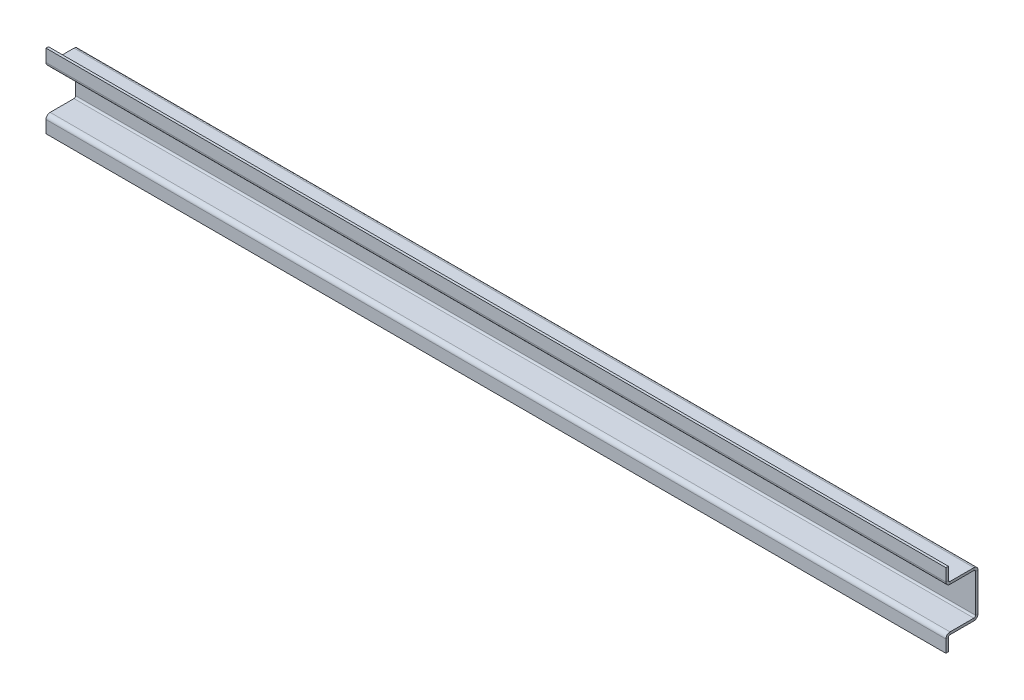
ISO-10303-21;
HEADER;
FILE_DESCRIPTION(('STEP AP214'),'2;1');
FILE_NAME('part.step','',(''),(''),'','','');
FILE_SCHEMA(('AUTOMOTIVE_DESIGN { 1 0 10303 214 1 1 1 1 }'));
ENDSEC;
DATA;
#1=APPLICATION_CONTEXT('core data for automotive mechanical design processes');
#2=APPLICATION_PROTOCOL_DEFINITION('international standard','automotive_design',2000,#1);
#3=PRODUCT_CONTEXT('',#1,'mechanical');
#4=PRODUCT('Part','Part','',(#3));
#5=PRODUCT_RELATED_PRODUCT_CATEGORY('part','',(#4));
#6=PRODUCT_DEFINITION_FORMATION('','',#4);
#7=PRODUCT_DEFINITION_CONTEXT('part definition',#1,'design');
#8=PRODUCT_DEFINITION('design','',#6,#7);
#9=PRODUCT_DEFINITION_SHAPE('','',#8);
#10=(LENGTH_UNIT() NAMED_UNIT(*) SI_UNIT(.MILLI.,.METRE.));
#11=(NAMED_UNIT(*) PLANE_ANGLE_UNIT() SI_UNIT($,.RADIAN.));
#12=(NAMED_UNIT(*) SI_UNIT($,.STERADIAN.) SOLID_ANGLE_UNIT());
#13=UNCERTAINTY_MEASURE_WITH_UNIT(LENGTH_MEASURE(1.E-05),#10,'distance_accuracy_value','');
#14=(GEOMETRIC_REPRESENTATION_CONTEXT(3) GLOBAL_UNCERTAINTY_ASSIGNED_CONTEXT((#13)) GLOBAL_UNIT_ASSIGNED_CONTEXT((#10,
#11,#12)) REPRESENTATION_CONTEXT('',''));
#15=CARTESIAN_POINT('',(0.,0.,0.));
#16=DIRECTION('',(0.,0.,1.));
#17=DIRECTION('',(1.,0.,0.));
#18=AXIS2_PLACEMENT_3D('',#15,#16,#17);
#19=CARTESIAN_POINT('',(273.,97.0000000000014,-1093.60301711881));
#20=DIRECTION('',(0.,-1.,0.));
#21=DIRECTION('',(0.,0.,-1.));
#22=AXIS2_PLACEMENT_3D('',#19,#20,#21);
#23=PLANE('',#22);
#24=DIRECTION('',(0.,0.,1.));
#25=VECTOR('',#24,1.);
#26=CARTESIAN_POINT('',(273.,97.0000000000014,-1093.60301711881));
#27=LINE('',#26,#25);
#28=CARTESIAN_POINT('',(273.,97.0000000000014,-3.0000000000001));
#29=VERTEX_POINT('',#28);
#30=CARTESIAN_POINT('',(273.,97.0000000000014,-1.5));
#31=VERTEX_POINT('',#30);
#32=EDGE_CURVE('E348',#29,#31,#27,.T.);
#33=ORIENTED_EDGE('',*,*,#32,.T.);
#34=DIRECTION('',(1.,0.,0.));
#35=VECTOR('',#34,1.);
#36=CARTESIAN_POINT('',(273.,97.0000000000014,-1.49999999999999));
#37=LINE('',#36,#35);
#38=CARTESIAN_POINT('',(-273.,97.0000000000014,-1.49999999999999));
#39=VERTEX_POINT('',#38);
#40=EDGE_CURVE('E339',#39,#31,#37,.T.);
#41=ORIENTED_EDGE('',*,*,#40,.F.);
#42=DIRECTION('',(0.,0.,1.));
#43=VECTOR('',#42,1.);
#44=CARTESIAN_POINT('',(-273.,97.0000000000014,-1093.60301711881));
#45=LINE('',#44,#43);
#46=CARTESIAN_POINT('',(-273.,97.0000000000014,-3.0000000000001));
#47=VERTEX_POINT('',#46);
#48=EDGE_CURVE('E336',#47,#39,#45,.T.);
#49=ORIENTED_EDGE('',*,*,#48,.F.);
#50=DIRECTION('',(1.,0.,0.));
#51=VECTOR('',#50,1.);
#52=CARTESIAN_POINT('',(273.,97.0000000000014,-2.99999999999999));
#53=LINE('',#52,#51);
#54=EDGE_CURVE('E86',#47,#29,#53,.T.);
#55=ORIENTED_EDGE('',*,*,#54,.T.);
#56=EDGE_LOOP('',(#33,#41,#49,#55));
#57=FACE_BOUND('',#56,.T.);
#58=ADVANCED_FACE('F42',(#57),#23,.T.);
#59=CARTESIAN_POINT('',(273.,133.500000000001,-1093.60301711881));
#60=DIRECTION('',(1.,0.,0.));
#61=DIRECTION('',(0.,0.,-1.));
#62=AXIS2_PLACEMENT_3D('',#59,#60,#61);
#63=PLANE('',#62);
#64=DIRECTION('',(0.,0.,1.));
#65=VECTOR('',#64,1.);
#66=CARTESIAN_POINT('',(273.,104.500000000001,-1093.60301711881));
#67=LINE('',#66,#65);
#68=CARTESIAN_POINT('',(273.,104.500000000001,-2.99999999999999));
#69=VERTEX_POINT('',#68);
#70=CARTESIAN_POINT('',(273.,104.500000000001,-1.49999999999999));
#71=VERTEX_POINT('',#70);
#72=EDGE_CURVE('E345',#69,#71,#67,.T.);
#73=ORIENTED_EDGE('',*,*,#72,.T.);
#74=DIRECTION('',(0.,1.,0.));
#75=VECTOR('',#74,1.);
#76=CARTESIAN_POINT('',(273.,133.500000000001,-1.49999999999999));
#77=LINE('',#76,#75);
#78=EDGE_CURVE('E342',#71,#31,#77,.F.);
#79=ORIENTED_EDGE('',*,*,#78,.T.);
#80=ORIENTED_EDGE('',*,*,#32,.F.);
#81=DIRECTION('',(0.,1.,0.));
#82=VECTOR('',#81,1.);
#83=CARTESIAN_POINT('',(273.,133.500000000001,-2.99999999999999));
#84=LINE('',#83,#82);
#85=EDGE_CURVE('E80',#29,#69,#84,.T.);
#86=ORIENTED_EDGE('',*,*,#85,.T.);
#87=EDGE_LOOP('',(#73,#79,#80,#86));
#88=FACE_BOUND('',#87,.T.);
#89=ADVANCED_FACE('F358',(#88),#63,.T.);
#90=CARTESIAN_POINT('',(273.,107.000000000001,-1.49999999999999));
#91=DIRECTION('',(0.,0.,1.));
#92=DIRECTION('',(0.,-1.,0.));
#93=AXIS2_PLACEMENT_3D('',#90,#91,#92);
#94=PLANE('',#93);
#95=DIRECTION('',(0.,1.,0.));
#96=VECTOR('',#95,1.);
#97=CARTESIAN_POINT('',(-273.,105.500000000001,-1.49999999999999));
#98=LINE('',#97,#96);
#99=CARTESIAN_POINT('',(-273.,104.500000000001,-1.49999999999999));
#100=VERTEX_POINT('',#99);
#101=EDGE_CURVE('E52',#39,#100,#98,.T.);
#102=ORIENTED_EDGE('',*,*,#101,.F.);
#103=ORIENTED_EDGE('',*,*,#40,.T.);
#104=ORIENTED_EDGE('',*,*,#78,.F.);
#105=DIRECTION('',(-1.,0.,0.));
#106=VECTOR('',#105,1.);
#107=CARTESIAN_POINT('',(273.,104.500000000001,-1.49999999999999));
#108=LINE('',#107,#106);
#109=EDGE_CURVE('E350',#100,#71,#108,.F.);
#110=ORIENTED_EDGE('',*,*,#109,.F.);
#111=EDGE_LOOP('',(#102,#103,#104,#110));
#112=FACE_BOUND('',#111,.T.);
#113=ADVANCED_FACE('F360',(#112),#94,.T.);
#114=CARTESIAN_POINT('',(-273.,105.500000000001,-1093.60301711881));
#115=DIRECTION('',(-1.,0.,0.));
#116=DIRECTION('',(0.,0.,1.));
#117=AXIS2_PLACEMENT_3D('',#114,#115,#116);
#118=PLANE('',#117);
#119=ORIENTED_EDGE('',*,*,#48,.T.);
#120=ORIENTED_EDGE('',*,*,#101,.T.);
#121=DIRECTION('',(0.,0.,1.));
#122=VECTOR('',#121,1.);
#123=CARTESIAN_POINT('',(-273.,104.500000000001,-1093.60301711881));
#124=LINE('',#123,#122);
#125=CARTESIAN_POINT('',(-273.,104.500000000001,-2.99999999999999));
#126=VERTEX_POINT('',#125);
#127=EDGE_CURVE('E256',#126,#100,#124,.T.);
#128=ORIENTED_EDGE('',*,*,#127,.F.);
#129=DIRECTION('',(0.,1.,0.));
#130=VECTOR('',#129,1.);
#131=CARTESIAN_POINT('',(-273.,105.500000000001,-2.99999999999999));
#132=LINE('',#131,#130);
#133=EDGE_CURVE('E11',#126,#47,#132,.F.);
#134=ORIENTED_EDGE('',*,*,#133,.T.);
#135=EDGE_LOOP('',(#119,#120,#128,#134));
#136=FACE_BOUND('',#135,.T.);
#137=ADVANCED_FACE('F363',(#136),#118,.T.);
#138=CARTESIAN_POINT('',(273.,107.000000000001,-2.99999999999999));
#139=DIRECTION('',(0.,0.,1.));
#140=DIRECTION('',(0.,-1.,0.));
#141=AXIS2_PLACEMENT_3D('',#138,#139,#140);
#142=PLANE('',#141);
#143=ORIENTED_EDGE('',*,*,#85,.F.);
#144=ORIENTED_EDGE('',*,*,#54,.F.);
#145=ORIENTED_EDGE('',*,*,#133,.F.);
#146=DIRECTION('',(1.,0.,0.));
#147=VECTOR('',#146,1.);
#148=CARTESIAN_POINT('',(273.,104.500000000001,-2.99999999999999));
#149=LINE('',#148,#147);
#150=EDGE_CURVE('E46',#69,#126,#149,.F.);
#151=ORIENTED_EDGE('',*,*,#150,.F.);
#152=EDGE_LOOP('',(#143,#144,#145,#151));
#153=FACE_BOUND('',#152,.T.);
#154=ADVANCED_FACE('F44',(#153),#142,.F.);
#155=CARTESIAN_POINT('',(273.,142.000000000001,-1093.60301711881));
#156=DIRECTION('',(0.,1.,0.));
#157=DIRECTION('',(0.,0.,1.));
#158=AXIS2_PLACEMENT_3D('',#155,#156,#157);
#159=PLANE('',#158);
#160=DIRECTION('',(0.,0.,1.));
#161=VECTOR('',#160,1.);
#162=CARTESIAN_POINT('',(-273.,142.000000000001,-1093.60301711881));
#163=LINE('',#162,#161);
#164=CARTESIAN_POINT('',(-273.,142.000000000001,-2.99999999999989));
#165=VERTEX_POINT('',#164);
#166=CARTESIAN_POINT('',(-273.,142.000000000001,-1.5));
#167=VERTEX_POINT('',#166);
#168=EDGE_CURVE('E327',#165,#167,#163,.T.);
#169=ORIENTED_EDGE('',*,*,#168,.T.);
#170=DIRECTION('',(1.,0.,0.));
#171=VECTOR('',#170,1.);
#172=CARTESIAN_POINT('',(273.,142.000000000001,-1.5));
#173=LINE('',#172,#171);
#174=CARTESIAN_POINT('',(273.,142.000000000001,-1.50000000000006));
#175=VERTEX_POINT('',#174);
#176=EDGE_CURVE('E94',#175,#167,#173,.F.);
#177=ORIENTED_EDGE('',*,*,#176,.F.);
#178=DIRECTION('',(0.,0.,1.));
#179=VECTOR('',#178,1.);
#180=CARTESIAN_POINT('',(273.,142.000000000001,-1093.60301711881));
#181=LINE('',#180,#179);
#182=CARTESIAN_POINT('',(273.,142.000000000001,-3.));
#183=VERTEX_POINT('',#182);
#184=EDGE_CURVE('E113',#183,#175,#181,.T.);
#185=ORIENTED_EDGE('',*,*,#184,.F.);
#186=DIRECTION('',(1.,0.,0.));
#187=VECTOR('',#186,1.);
#188=CARTESIAN_POINT('',(273.,142.000000000001,-3.));
#189=LINE('',#188,#187);
#190=EDGE_CURVE('E109',#183,#165,#189,.F.);
#191=ORIENTED_EDGE('',*,*,#190,.T.);
#192=EDGE_LOOP('',(#169,#177,#185,#191));
#193=FACE_BOUND('',#192,.T.);
#194=ADVANCED_FACE('F494',(#193),#159,.T.);
#195=CARTESIAN_POINT('',(-273.,105.500000000001,-1093.60301711881));
#196=DIRECTION('',(-1.,0.,0.));
#197=DIRECTION('',(0.,0.,1.));
#198=AXIS2_PLACEMENT_3D('',#195,#196,#197);
#199=PLANE('',#198);
#200=DIRECTION('',(0.,0.,1.));
#201=VECTOR('',#200,1.);
#202=CARTESIAN_POINT('',(-273.,134.500000000001,-1093.60301711881));
#203=LINE('',#202,#201);
#204=CARTESIAN_POINT('',(-273.,134.500000000001,-3.00000000000001));
#205=VERTEX_POINT('',#204);
#206=CARTESIAN_POINT('',(-273.,134.500000000001,-1.50000000000001));
#207=VERTEX_POINT('',#206);
#208=EDGE_CURVE('E323',#205,#207,#203,.T.);
#209=ORIENTED_EDGE('',*,*,#208,.T.);
#210=DIRECTION('',(0.,1.,0.));
#211=VECTOR('',#210,1.);
#212=CARTESIAN_POINT('',(-273.,105.500000000001,-1.5));
#213=LINE('',#212,#211);
#214=EDGE_CURVE('E321',#207,#167,#213,.T.);
#215=ORIENTED_EDGE('',*,*,#214,.T.);
#216=ORIENTED_EDGE('',*,*,#168,.F.);
#217=DIRECTION('',(0.,1.,0.));
#218=VECTOR('',#217,1.);
#219=CARTESIAN_POINT('',(-273.,105.500000000001,-3.));
#220=LINE('',#219,#218);
#221=EDGE_CURVE('E318',#165,#205,#220,.F.);
#222=ORIENTED_EDGE('',*,*,#221,.T.);
#223=EDGE_LOOP('',(#209,#215,#216,#222));
#224=FACE_BOUND('',#223,.T.);
#225=ADVANCED_FACE('F493',(#224),#199,.T.);
#226=CARTESIAN_POINT('',(273.,142.000000000001,-1.5));
#227=DIRECTION('',(0.,0.,1.));
#228=DIRECTION('',(1.,0.,0.));
#229=AXIS2_PLACEMENT_3D('',#226,#227,#228);
#230=PLANE('',#229);
#231=ORIENTED_EDGE('',*,*,#214,.F.);
#232=DIRECTION('',(1.,0.,0.));
#233=VECTOR('',#232,1.);
#234=CARTESIAN_POINT('',(273.,134.500000000001,-1.5));
#235=LINE('',#234,#233);
#236=CARTESIAN_POINT('',(273.,134.500000000001,-1.5));
#237=VERTEX_POINT('',#236);
#238=EDGE_CURVE('E315',#207,#237,#235,.T.);
#239=ORIENTED_EDGE('',*,*,#238,.T.);
#240=DIRECTION('',(0.,1.,0.));
#241=VECTOR('',#240,1.);
#242=CARTESIAN_POINT('',(273.,133.500000000001,-1.5));
#243=LINE('',#242,#241);
#244=EDGE_CURVE('E310',#175,#237,#243,.F.);
#245=ORIENTED_EDGE('',*,*,#244,.F.);
#246=ORIENTED_EDGE('',*,*,#176,.T.);
#247=EDGE_LOOP('',(#231,#239,#245,#246));
#248=FACE_BOUND('',#247,.T.);
#249=ADVANCED_FACE('F485',(#248),#230,.T.);
#250=CARTESIAN_POINT('',(273.,133.500000000001,-1093.60301711881));
#251=DIRECTION('',(1.,0.,0.));
#252=DIRECTION('',(0.,0.,-1.));
#253=AXIS2_PLACEMENT_3D('',#250,#251,#252);
#254=PLANE('',#253);
#255=ORIENTED_EDGE('',*,*,#184,.T.);
#256=ORIENTED_EDGE('',*,*,#244,.T.);
#257=DIRECTION('',(0.,0.,1.));
#258=VECTOR('',#257,1.);
#259=CARTESIAN_POINT('',(273.,134.500000000001,-1093.60301711881));
#260=LINE('',#259,#258);
#261=CARTESIAN_POINT('',(273.,134.500000000001,-3.00000000000001));
#262=VERTEX_POINT('',#261);
#263=EDGE_CURVE('E329',#262,#237,#260,.T.);
#264=ORIENTED_EDGE('',*,*,#263,.F.);
#265=DIRECTION('',(0.,1.,0.));
#266=VECTOR('',#265,1.);
#267=CARTESIAN_POINT('',(273.,133.500000000001,-3.));
#268=LINE('',#267,#266);
#269=EDGE_CURVE('E308',#262,#183,#268,.T.);
#270=ORIENTED_EDGE('',*,*,#269,.T.);
#271=EDGE_LOOP('',(#255,#256,#264,#270));
#272=FACE_BOUND('',#271,.T.);
#273=ADVANCED_FACE('F486',(#272),#254,.T.);
#274=CARTESIAN_POINT('',(273.,142.000000000001,-3.));
#275=DIRECTION('',(0.,0.,1.));
#276=DIRECTION('',(1.,0.,0.));
#277=AXIS2_PLACEMENT_3D('',#274,#275,#276);
#278=PLANE('',#277);
#279=ORIENTED_EDGE('',*,*,#269,.F.);
#280=DIRECTION('',(1.,0.,0.));
#281=VECTOR('',#280,1.);
#282=CARTESIAN_POINT('',(273.,134.500000000001,-3.));
#283=LINE('',#282,#281);
#284=EDGE_CURVE('E281',#205,#262,#283,.T.);
#285=ORIENTED_EDGE('',*,*,#284,.F.);
#286=ORIENTED_EDGE('',*,*,#221,.F.);
#287=ORIENTED_EDGE('',*,*,#190,.F.);
#288=EDGE_LOOP('',(#279,#285,#286,#287));
#289=FACE_BOUND('',#288,.T.);
#290=ADVANCED_FACE('F491',(#289),#278,.F.);
#291=CARTESIAN_POINT('',(273.,-960.385005389582,-18.5));
#292=DIRECTION('',(1.,0.,0.));
#293=DIRECTION('',(0.,1.,0.));
#294=AXIS2_PLACEMENT_3D('',#291,#292,#293);
#295=PLANE('',#294);
#296=DIRECTION('',(0.,0.,-1.));
#297=VECTOR('',#296,1.);
#298=CARTESIAN_POINT('',(273.,133.500000000001,-18.5));
#299=LINE('',#298,#297);
#300=CARTESIAN_POINT('',(273.,133.500000000001,-18.5));
#301=VERTEX_POINT('',#300);
#302=CARTESIAN_POINT('',(273.,133.500000000001,-4.));
#303=VERTEX_POINT('',#302);
#304=EDGE_CURVE('E293',#301,#303,#299,.F.);
#305=ORIENTED_EDGE('',*,*,#304,.T.);
#306=DIRECTION('',(0.,1.,0.));
#307=VECTOR('',#306,1.);
#308=CARTESIAN_POINT('',(273.,-960.385005389582,-4.00000000000003));
#309=LINE('',#308,#307);
#310=CARTESIAN_POINT('',(273.,132.000000000001,-4.));
#311=VERTEX_POINT('',#310);
#312=EDGE_CURVE('E296',#311,#303,#309,.T.);
#313=ORIENTED_EDGE('',*,*,#312,.F.);
#314=DIRECTION('',(0.,0.,-1.));
#315=VECTOR('',#314,1.);
#316=CARTESIAN_POINT('',(273.,132.000000000001,-18.5));
#317=LINE('',#316,#315);
#318=CARTESIAN_POINT('',(273.,132.000000000001,-18.5));
#319=VERTEX_POINT('',#318);
#320=EDGE_CURVE('E291',#311,#319,#317,.T.);
#321=ORIENTED_EDGE('',*,*,#320,.T.);
#322=DIRECTION('',(0.,1.,0.));
#323=VECTOR('',#322,1.);
#324=CARTESIAN_POINT('',(273.,-960.385005389582,-18.5));
#325=LINE('',#324,#323);
#326=EDGE_CURVE('E288',#319,#301,#325,.T.);
#327=ORIENTED_EDGE('',*,*,#326,.T.);
#328=EDGE_LOOP('',(#305,#313,#321,#327));
#329=FACE_BOUND('',#328,.T.);
#330=ADVANCED_FACE('F475',(#329),#295,.T.);
#331=CARTESIAN_POINT('',(273.,133.500000000001,-1.5));
#332=DIRECTION('',(0.,-1.,0.));
#333=DIRECTION('',(0.,0.,-1.));
#334=AXIS2_PLACEMENT_3D('',#331,#332,#333);
#335=PLANE('',#334);
#336=ORIENTED_EDGE('',*,*,#304,.F.);
#337=DIRECTION('',(-1.,0.,0.));
#338=VECTOR('',#337,1.);
#339=CARTESIAN_POINT('',(273.,133.500000000001,-18.5));
#340=LINE('',#339,#338);
#341=CARTESIAN_POINT('',(-273.,133.500000000001,-18.5));
#342=VERTEX_POINT('',#341);
#343=EDGE_CURVE('E302',#342,#301,#340,.F.);
#344=ORIENTED_EDGE('',*,*,#343,.F.);
#345=DIRECTION('',(0.,0.,1.));
#346=VECTOR('',#345,1.);
#347=CARTESIAN_POINT('',(-273.,133.500000000001,-18.5));
#348=LINE('',#347,#346);
#349=CARTESIAN_POINT('',(-273.,133.500000000001,-4.00000000000003));
#350=VERTEX_POINT('',#349);
#351=EDGE_CURVE('E286',#350,#342,#348,.F.);
#352=ORIENTED_EDGE('',*,*,#351,.F.);
#353=DIRECTION('',(1.,0.,0.));
#354=VECTOR('',#353,1.);
#355=CARTESIAN_POINT('',(273.,133.500000000001,-4.));
#356=LINE('',#355,#354);
#357=EDGE_CURVE('E298',#303,#350,#356,.F.);
#358=ORIENTED_EDGE('',*,*,#357,.F.);
#359=EDGE_LOOP('',(#336,#344,#352,#358));
#360=FACE_BOUND('',#359,.T.);
#361=ADVANCED_FACE('F472',(#360),#335,.F.);
#362=CARTESIAN_POINT('',(-273.,-960.385005389582,-18.5));
#363=DIRECTION('',(-1.,0.,0.));
#364=DIRECTION('',(0.,-1.,0.));
#365=AXIS2_PLACEMENT_3D('',#362,#363,#364);
#366=PLANE('',#365);
#367=ORIENTED_EDGE('',*,*,#351,.T.);
#368=DIRECTION('',(0.,1.,0.));
#369=VECTOR('',#368,1.);
#370=CARTESIAN_POINT('',(-273.,-960.385005389582,-18.5));
#371=LINE('',#370,#369);
#372=CARTESIAN_POINT('',(-273.,132.000000000001,-18.5));
#373=VERTEX_POINT('',#372);
#374=EDGE_CURVE('E305',#373,#342,#371,.T.);
#375=ORIENTED_EDGE('',*,*,#374,.F.);
#376=DIRECTION('',(0.,0.,1.));
#377=VECTOR('',#376,1.);
#378=CARTESIAN_POINT('',(-273.,132.000000000001,-18.5));
#379=LINE('',#378,#377);
#380=CARTESIAN_POINT('',(-273.,132.000000000001,-4.00000000000005));
#381=VERTEX_POINT('',#380);
#382=EDGE_CURVE('E135',#373,#381,#379,.T.);
#383=ORIENTED_EDGE('',*,*,#382,.T.);
#384=DIRECTION('',(0.,1.,0.));
#385=VECTOR('',#384,1.);
#386=CARTESIAN_POINT('',(-273.,-960.385005389582,-4.00000000000003));
#387=LINE('',#386,#385);
#388=EDGE_CURVE('E282',#381,#350,#387,.T.);
#389=ORIENTED_EDGE('',*,*,#388,.T.);
#390=EDGE_LOOP('',(#367,#375,#383,#389));
#391=FACE_BOUND('',#390,.T.);
#392=ADVANCED_FACE('F468',(#391),#366,.T.);
#393=CARTESIAN_POINT('',(273.,132.000000000001,-1.5));
#394=DIRECTION('',(0.,-1.,0.));
#395=DIRECTION('',(0.,0.,-1.));
#396=AXIS2_PLACEMENT_3D('',#393,#394,#395);
#397=PLANE('',#396);
#398=ORIENTED_EDGE('',*,*,#382,.F.);
#399=DIRECTION('',(-1.,0.,0.));
#400=VECTOR('',#399,1.);
#401=CARTESIAN_POINT('',(273.,132.000000000001,-18.5));
#402=LINE('',#401,#400);
#403=EDGE_CURVE('E140',#373,#319,#402,.F.);
#404=ORIENTED_EDGE('',*,*,#403,.T.);
#405=ORIENTED_EDGE('',*,*,#320,.F.);
#406=DIRECTION('',(-1.,0.,0.));
#407=VECTOR('',#406,1.);
#408=CARTESIAN_POINT('',(273.,132.000000000001,-4.));
#409=LINE('',#408,#407);
#410=EDGE_CURVE('E300',#381,#311,#409,.F.);
#411=ORIENTED_EDGE('',*,*,#410,.F.);
#412=EDGE_LOOP('',(#398,#404,#405,#411));
#413=FACE_BOUND('',#412,.T.);
#414=ADVANCED_FACE('F476',(#413),#397,.T.);
#415=CARTESIAN_POINT('',(-273.,1199.38500538958,-18.5));
#416=DIRECTION('',(-1.,0.,0.));
#417=DIRECTION('',(0.,1.,0.));
#418=AXIS2_PLACEMENT_3D('',#415,#416,#417);
#419=PLANE('',#418);
#420=DIRECTION('',(0.,0.,1.));
#421=VECTOR('',#420,1.);
#422=CARTESIAN_POINT('',(-273.,105.500000000001,-18.5));
#423=LINE('',#422,#421);
#424=CARTESIAN_POINT('',(-273.,105.500000000001,-18.5));
#425=VERTEX_POINT('',#424);
#426=CARTESIAN_POINT('',(-273.,105.500000000001,-3.99999999999999));
#427=VERTEX_POINT('',#426);
#428=EDGE_CURVE('E261',#425,#427,#423,.T.);
#429=ORIENTED_EDGE('',*,*,#428,.T.);
#430=DIRECTION('',(0.,-1.,0.));
#431=VECTOR('',#430,1.);
#432=CARTESIAN_POINT('',(-273.,1199.38500538958,-3.99999999999999));
#433=LINE('',#432,#431);
#434=CARTESIAN_POINT('',(-273.,107.000000000001,-3.99999999999999));
#435=VERTEX_POINT('',#434);
#436=EDGE_CURVE('E254',#435,#427,#433,.T.);
#437=ORIENTED_EDGE('',*,*,#436,.F.);
#438=DIRECTION('',(0.,0.,1.));
#439=VECTOR('',#438,1.);
#440=CARTESIAN_POINT('',(-273.,107.000000000001,-18.5));
#441=LINE('',#440,#439);
#442=CARTESIAN_POINT('',(-273.,107.000000000001,-18.5));
#443=VERTEX_POINT('',#442);
#444=EDGE_CURVE('E169',#435,#443,#441,.F.);
#445=ORIENTED_EDGE('',*,*,#444,.T.);
#446=DIRECTION('',(0.,-1.,0.));
#447=VECTOR('',#446,1.);
#448=CARTESIAN_POINT('',(-273.,1199.38500538958,-18.5));
#449=LINE('',#448,#447);
#450=EDGE_CURVE('E267',#443,#425,#449,.T.);
#451=ORIENTED_EDGE('',*,*,#450,.T.);
#452=EDGE_LOOP('',(#429,#437,#445,#451));
#453=FACE_BOUND('',#452,.T.);
#454=ADVANCED_FACE('F259',(#453),#419,.T.);
#455=CARTESIAN_POINT('',(273.,105.500000000001,-19.5));
#456=DIRECTION('',(0.,1.,0.));
#457=DIRECTION('',(0.,0.,1.));
#458=AXIS2_PLACEMENT_3D('',#455,#456,#457);
#459=PLANE('',#458);
#460=DIRECTION('',(0.,0.,-1.));
#461=VECTOR('',#460,1.);
#462=CARTESIAN_POINT('',(273.,105.500000000001,-18.5));
#463=LINE('',#462,#461);
#464=CARTESIAN_POINT('',(273.,105.500000000001,-3.99999999999999));
#465=VERTEX_POINT('',#464);
#466=CARTESIAN_POINT('',(273.,105.500000000001,-18.5));
#467=VERTEX_POINT('',#466);
#468=EDGE_CURVE('E269',#465,#467,#463,.T.);
#469=ORIENTED_EDGE('',*,*,#468,.F.);
#470=DIRECTION('',(1.,0.,0.));
#471=VECTOR('',#470,1.);
#472=CARTESIAN_POINT('',(273.,105.500000000001,-3.99999999999999));
#473=LINE('',#472,#471);
#474=EDGE_CURVE('E262',#427,#465,#473,.T.);
#475=ORIENTED_EDGE('',*,*,#474,.F.);
#476=ORIENTED_EDGE('',*,*,#428,.F.);
#477=DIRECTION('',(1.,0.,0.));
#478=VECTOR('',#477,1.);
#479=CARTESIAN_POINT('',(273.,105.500000000001,-18.5));
#480=LINE('',#479,#478);
#481=EDGE_CURVE('E275',#467,#425,#480,.F.);
#482=ORIENTED_EDGE('',*,*,#481,.F.);
#483=EDGE_LOOP('',(#469,#475,#476,#482));
#484=FACE_BOUND('',#483,.T.);
#485=ADVANCED_FACE('F533',(#484),#459,.F.);
#486=CARTESIAN_POINT('',(273.,1199.38500538958,-18.5));
#487=DIRECTION('',(1.,0.,0.));
#488=DIRECTION('',(0.,-1.,0.));
#489=AXIS2_PLACEMENT_3D('',#486,#487,#488);
#490=PLANE('',#489);
#491=ORIENTED_EDGE('',*,*,#468,.T.);
#492=DIRECTION('',(0.,-1.,0.));
#493=VECTOR('',#492,1.);
#494=CARTESIAN_POINT('',(273.,1199.38500538958,-18.5));
#495=LINE('',#494,#493);
#496=CARTESIAN_POINT('',(273.,107.000000000001,-18.5));
#497=VERTEX_POINT('',#496);
#498=EDGE_CURVE('E162',#497,#467,#495,.T.);
#499=ORIENTED_EDGE('',*,*,#498,.F.);
#500=DIRECTION('',(0.,0.,-1.));
#501=VECTOR('',#500,1.);
#502=CARTESIAN_POINT('',(273.,107.000000000001,-18.5));
#503=LINE('',#502,#501);
#504=CARTESIAN_POINT('',(273.,107.000000000001,-3.99999999999999));
#505=VERTEX_POINT('',#504);
#506=EDGE_CURVE('E427',#497,#505,#503,.F.);
#507=ORIENTED_EDGE('',*,*,#506,.T.);
#508=DIRECTION('',(0.,-1.,0.));
#509=VECTOR('',#508,1.);
#510=CARTESIAN_POINT('',(273.,1199.38500538958,-3.99999999999999));
#511=LINE('',#510,#509);
#512=EDGE_CURVE('E248',#505,#465,#511,.T.);
#513=ORIENTED_EDGE('',*,*,#512,.T.);
#514=EDGE_LOOP('',(#491,#499,#507,#513));
#515=FACE_BOUND('',#514,.T.);
#516=ADVANCED_FACE('F429',(#515),#490,.T.);
#517=CARTESIAN_POINT('',(273.,107.000000000001,-19.5));
#518=DIRECTION('',(0.,1.,0.));
#519=DIRECTION('',(0.,0.,1.));
#520=AXIS2_PLACEMENT_3D('',#517,#518,#519);
#521=PLANE('',#520);
#522=ORIENTED_EDGE('',*,*,#444,.F.);
#523=DIRECTION('',(1.,0.,0.));
#524=VECTOR('',#523,1.);
#525=CARTESIAN_POINT('',(273.,107.000000000001,-3.99999999999999));
#526=LINE('',#525,#524);
#527=EDGE_CURVE('E239',#435,#505,#526,.T.);
#528=ORIENTED_EDGE('',*,*,#527,.T.);
#529=ORIENTED_EDGE('',*,*,#506,.F.);
#530=DIRECTION('',(-1.,0.,0.));
#531=VECTOR('',#530,1.);
#532=CARTESIAN_POINT('',(273.,107.000000000001,-18.5));
#533=LINE('',#532,#531);
#534=EDGE_CURVE('E247',#497,#443,#533,.T.);
#535=ORIENTED_EDGE('',*,*,#534,.T.);
#536=EDGE_LOOP('',(#522,#528,#529,#535));
#537=FACE_BOUND('',#536,.T.);
#538=ADVANCED_FACE('F264',(#537),#521,.T.);
#539=CARTESIAN_POINT('',(273.,132.000000000001,-21.));
#540=DIRECTION('',(0.,0.,1.));
#541=DIRECTION('',(1.,0.,0.));
#542=AXIS2_PLACEMENT_3D('',#539,#540,#541);
#543=PLANE('',#542);
#544=DIRECTION('',(0.,1.,0.));
#545=VECTOR('',#544,1.);
#546=CARTESIAN_POINT('',(273.,133.500000000001,-21.));
#547=LINE('',#546,#545);
#548=CARTESIAN_POINT('',(273.,108.000000000001,-21.));
#549=VERTEX_POINT('',#548);
#550=CARTESIAN_POINT('',(273.,131.000000000001,-21.));
#551=VERTEX_POINT('',#550);
#552=EDGE_CURVE('E392',#549,#551,#547,.T.);
#553=ORIENTED_EDGE('',*,*,#552,.F.);
#554=DIRECTION('',(-1.,0.,0.));
#555=VECTOR('',#554,1.);
#556=CARTESIAN_POINT('',(273.,108.000000000001,-21.));
#557=LINE('',#556,#555);
#558=CARTESIAN_POINT('',(-273.,108.000000000001,-21.));
#559=VERTEX_POINT('',#558);
#560=EDGE_CURVE('E177',#559,#549,#557,.F.);
#561=ORIENTED_EDGE('',*,*,#560,.F.);
#562=DIRECTION('',(0.,1.,0.));
#563=VECTOR('',#562,1.);
#564=CARTESIAN_POINT('',(-273.,105.500000000001,-21.));
#565=LINE('',#564,#563);
#566=CARTESIAN_POINT('',(-273.,131.000000000001,-21.));
#567=VERTEX_POINT('',#566);
#568=EDGE_CURVE('E399',#567,#559,#565,.F.);
#569=ORIENTED_EDGE('',*,*,#568,.F.);
#570=DIRECTION('',(-1.,0.,0.));
#571=VECTOR('',#570,1.);
#572=CARTESIAN_POINT('',(273.,131.000000000001,-21.));
#573=LINE('',#572,#571);
#574=EDGE_CURVE('E185',#551,#567,#573,.T.);
#575=ORIENTED_EDGE('',*,*,#574,.F.);
#576=EDGE_LOOP('',(#553,#561,#569,#575));
#577=FACE_BOUND('',#576,.T.);
#578=ADVANCED_FACE('F464',(#577),#543,.F.);
#579=CARTESIAN_POINT('',(-273.,132.000000000001,1073.46843504284));
#580=DIRECTION('',(1.,0.,0.));
#581=DIRECTION('',(0.,0.,-1.));
#582=AXIS2_PLACEMENT_3D('',#579,#580,#581);
#583=PLANE('',#582);
#584=DIRECTION('',(0.,0.,-1.));
#585=VECTOR('',#584,1.);
#586=CARTESIAN_POINT('',(-273.,131.000000000001,1073.46843504284));
#587=LINE('',#586,#585);
#588=CARTESIAN_POINT('',(-273.,131.000000000001,-19.5));
#589=VERTEX_POINT('',#588);
#590=EDGE_CURVE('E415',#589,#567,#587,.T.);
#591=ORIENTED_EDGE('',*,*,#590,.T.);
#592=ORIENTED_EDGE('',*,*,#568,.T.);
#593=DIRECTION('',(0.,0.,-1.));
#594=VECTOR('',#593,1.);
#595=CARTESIAN_POINT('',(-273.,108.000000000001,1073.46843504284));
#596=LINE('',#595,#594);
#597=CARTESIAN_POINT('',(-273.,108.000000000001,-19.5));
#598=VERTEX_POINT('',#597);
#599=EDGE_CURVE('E279',#598,#559,#596,.T.);
#600=ORIENTED_EDGE('',*,*,#599,.F.);
#601=DIRECTION('',(0.,1.,0.));
#602=VECTOR('',#601,1.);
#603=CARTESIAN_POINT('',(-273.,132.000000000001,-19.5));
#604=LINE('',#603,#602);
#605=EDGE_CURVE('E403',#589,#598,#604,.F.);
#606=ORIENTED_EDGE('',*,*,#605,.F.);
#607=EDGE_LOOP('',(#591,#592,#600,#606));
#608=FACE_BOUND('',#607,.T.);
#609=ADVANCED_FACE('F444',(#608),#583,.F.);
#610=CARTESIAN_POINT('',(273.,132.000000000001,1073.46843504284));
#611=DIRECTION('',(-1.,0.,0.));
#612=DIRECTION('',(0.,0.,1.));
#613=AXIS2_PLACEMENT_3D('',#610,#611,#612);
#614=PLANE('',#613);
#615=DIRECTION('',(0.,0.,-1.));
#616=VECTOR('',#615,1.);
#617=CARTESIAN_POINT('',(273.,108.000000000001,1073.46843504284));
#618=LINE('',#617,#616);
#619=CARTESIAN_POINT('',(273.,108.000000000001,-19.5));
#620=VERTEX_POINT('',#619);
#621=EDGE_CURVE('E420',#620,#549,#618,.T.);
#622=ORIENTED_EDGE('',*,*,#621,.T.);
#623=ORIENTED_EDGE('',*,*,#552,.T.);
#624=DIRECTION('',(0.,0.,-1.));
#625=VECTOR('',#624,1.);
#626=CARTESIAN_POINT('',(273.,131.000000000001,1073.46843504284));
#627=LINE('',#626,#625);
#628=CARTESIAN_POINT('',(273.,131.000000000001,-19.5));
#629=VERTEX_POINT('',#628);
#630=EDGE_CURVE('E418',#629,#551,#627,.T.);
#631=ORIENTED_EDGE('',*,*,#630,.F.);
#632=DIRECTION('',(0.,1.,0.));
#633=VECTOR('',#632,1.);
#634=CARTESIAN_POINT('',(273.,132.000000000001,-19.5));
#635=LINE('',#634,#633);
#636=EDGE_CURVE('E409',#620,#629,#635,.T.);
#637=ORIENTED_EDGE('',*,*,#636,.F.);
#638=EDGE_LOOP('',(#622,#623,#631,#637));
#639=FACE_BOUND('',#638,.T.);
#640=ADVANCED_FACE('F456',(#639),#614,.F.);
#641=CARTESIAN_POINT('',(273.,132.000000000001,-19.5));
#642=DIRECTION('',(0.,0.,1.));
#643=DIRECTION('',(1.,0.,0.));
#644=AXIS2_PLACEMENT_3D('',#641,#642,#643);
#645=PLANE('',#644);
#646=ORIENTED_EDGE('',*,*,#605,.T.);
#647=DIRECTION('',(1.,0.,0.));
#648=VECTOR('',#647,1.);
#649=CARTESIAN_POINT('',(273.,108.000000000001,-19.5));
#650=LINE('',#649,#648);
#651=EDGE_CURVE('E406',#598,#620,#650,.T.);
#652=ORIENTED_EDGE('',*,*,#651,.T.);
#653=ORIENTED_EDGE('',*,*,#636,.T.);
#654=DIRECTION('',(1.,0.,0.));
#655=VECTOR('',#654,1.);
#656=CARTESIAN_POINT('',(273.,131.000000000001,-19.5));
#657=LINE('',#656,#655);
#658=EDGE_CURVE('E412',#629,#589,#657,.F.);
#659=ORIENTED_EDGE('',*,*,#658,.T.);
#660=EDGE_LOOP('',(#646,#652,#653,#659));
#661=FACE_BOUND('',#660,.T.);
#662=ADVANCED_FACE('F447',(#661),#645,.T.);
#663=CARTESIAN_POINT('',(273.,108.000000000001,-18.5));
#664=DIRECTION('',(1.,0.,0.));
#665=DIRECTION('',(0.,0.,-1.));
#666=AXIS2_PLACEMENT_3D('',#663,#664,#665);
#667=PLANE('',#666);
#668=ORIENTED_EDGE('',*,*,#621,.F.);
#669=CARTESIAN_POINT('',(273.,108.000000000001,-18.5));
#670=DIRECTION('',(1.,0.,0.));
#671=DIRECTION('',(0.,0.,-1.));
#672=AXIS2_PLACEMENT_3D('',#669,#670,#671);
#673=CIRCLE('',#672,0.999999999999993);
#674=EDGE_CURVE('E390',#620,#497,#673,.F.);
#675=ORIENTED_EDGE('',*,*,#674,.T.);
#676=ORIENTED_EDGE('',*,*,#498,.T.);
#677=CARTESIAN_POINT('',(273.,108.000000000001,-18.5));
#678=DIRECTION('',(1.,0.,0.));
#679=DIRECTION('',(0.,0.,-1.));
#680=AXIS2_PLACEMENT_3D('',#677,#678,#679);
#681=CIRCLE('',#680,2.49999999999999);
#682=EDGE_CURVE('E389',#549,#467,#681,.F.);
#683=ORIENTED_EDGE('',*,*,#682,.F.);
#684=EDGE_LOOP('',(#668,#675,#676,#683));
#685=FACE_BOUND('',#684,.T.);
#686=ADVANCED_FACE('F432',(#685),#667,.T.);
#687=CARTESIAN_POINT('',(-273.,108.000000000001,-18.5));
#688=DIRECTION('',(-1.,0.,0.));
#689=DIRECTION('',(0.,0.,1.));
#690=AXIS2_PLACEMENT_3D('',#687,#688,#689);
#691=PLANE('',#690);
#692=ORIENTED_EDGE('',*,*,#450,.F.);
#693=CARTESIAN_POINT('',(-273.,108.000000000001,-18.5));
#694=DIRECTION('',(1.,0.,0.));
#695=DIRECTION('',(0.,0.,-1.));
#696=AXIS2_PLACEMENT_3D('',#693,#694,#695);
#697=CIRCLE('',#696,0.999999999999993);
#698=EDGE_CURVE('E383',#443,#598,#697,.T.);
#699=ORIENTED_EDGE('',*,*,#698,.T.);
#700=ORIENTED_EDGE('',*,*,#599,.T.);
#701=CARTESIAN_POINT('',(-273.,108.000000000001,-18.5));
#702=DIRECTION('',(1.,0.,0.));
#703=DIRECTION('',(0.,0.,-1.));
#704=AXIS2_PLACEMENT_3D('',#701,#702,#703);
#705=CIRCLE('',#704,2.49999999999999);
#706=EDGE_CURVE('E387',#425,#559,#705,.T.);
#707=ORIENTED_EDGE('',*,*,#706,.F.);
#708=EDGE_LOOP('',(#692,#699,#700,#707));
#709=FACE_BOUND('',#708,.T.);
#710=ADVANCED_FACE('F438',(#709),#691,.T.);
#711=CARTESIAN_POINT('',(-824.404796859802,108.000000000001,-18.5));
#712=DIRECTION('',(1.,0.,0.));
#713=DIRECTION('',(0.,0.,-1.));
#714=AXIS2_PLACEMENT_3D('',#711,#712,#713);
#715=CYLINDRICAL_SURFACE('',#714,2.49999999999999);
#716=ORIENTED_EDGE('',*,*,#706,.T.);
#717=ORIENTED_EDGE('',*,*,#560,.T.);
#718=ORIENTED_EDGE('',*,*,#682,.T.);
#719=ORIENTED_EDGE('',*,*,#481,.T.);
#720=EDGE_LOOP('',(#716,#717,#718,#719));
#721=FACE_BOUND('',#720,.T.);
#722=ADVANCED_FACE('F435',(#721),#715,.T.);
#723=CARTESIAN_POINT('',(-824.404796859802,108.000000000001,-18.5));
#724=DIRECTION('',(1.,0.,0.));
#725=DIRECTION('',(0.,0.,-1.));
#726=AXIS2_PLACEMENT_3D('',#723,#724,#725);
#727=CYLINDRICAL_SURFACE('',#726,0.999999999999993);
#728=ORIENTED_EDGE('',*,*,#698,.F.);
#729=ORIENTED_EDGE('',*,*,#534,.F.);
#730=ORIENTED_EDGE('',*,*,#674,.F.);
#731=ORIENTED_EDGE('',*,*,#651,.F.);
#732=EDGE_LOOP('',(#728,#729,#730,#731));
#733=FACE_BOUND('',#732,.T.);
#734=ADVANCED_FACE('F715',(#733),#727,.F.);
#735=CARTESIAN_POINT('',(-273.,131.000000000001,-18.5));
#736=DIRECTION('',(-1.,0.,0.));
#737=DIRECTION('',(0.,0.,1.));
#738=AXIS2_PLACEMENT_3D('',#735,#736,#737);
#739=PLANE('',#738);
#740=ORIENTED_EDGE('',*,*,#590,.F.);
#741=CARTESIAN_POINT('',(-273.,131.000000000001,-18.5));
#742=DIRECTION('',(-1.,0.,0.));
#743=DIRECTION('',(0.,0.,1.));
#744=AXIS2_PLACEMENT_3D('',#741,#742,#743);
#745=CIRCLE('',#744,1.);
#746=EDGE_CURVE('E381',#589,#373,#745,.F.);
#747=ORIENTED_EDGE('',*,*,#746,.T.);
#748=ORIENTED_EDGE('',*,*,#374,.T.);
#749=CARTESIAN_POINT('',(-273.,131.000000000001,-18.5));
#750=DIRECTION('',(-1.,0.,0.));
#751=DIRECTION('',(0.,0.,1.));
#752=AXIS2_PLACEMENT_3D('',#749,#750,#751);
#753=CIRCLE('',#752,2.5);
#754=EDGE_CURVE('E380',#567,#342,#753,.F.);
#755=ORIENTED_EDGE('',*,*,#754,.F.);
#756=EDGE_LOOP('',(#740,#747,#748,#755));
#757=FACE_BOUND('',#756,.T.);
#758=ADVANCED_FACE('F466',(#757),#739,.T.);
#759=CARTESIAN_POINT('',(273.,131.000000000001,-18.5));
#760=DIRECTION('',(1.,0.,0.));
#761=DIRECTION('',(0.,0.,-1.));
#762=AXIS2_PLACEMENT_3D('',#759,#760,#761);
#763=PLANE('',#762);
#764=ORIENTED_EDGE('',*,*,#326,.F.);
#765=CARTESIAN_POINT('',(273.,131.000000000001,-18.5));
#766=DIRECTION('',(-1.,0.,0.));
#767=DIRECTION('',(0.,0.,1.));
#768=AXIS2_PLACEMENT_3D('',#765,#766,#767);
#769=CIRCLE('',#768,1.);
#770=EDGE_CURVE('E373',#319,#629,#769,.T.);
#771=ORIENTED_EDGE('',*,*,#770,.T.);
#772=ORIENTED_EDGE('',*,*,#630,.T.);
#773=CARTESIAN_POINT('',(273.,131.000000000001,-18.5));
#774=DIRECTION('',(-1.,0.,0.));
#775=DIRECTION('',(0.,0.,1.));
#776=AXIS2_PLACEMENT_3D('',#773,#774,#775);
#777=CIRCLE('',#776,2.5);
#778=EDGE_CURVE('E378',#301,#551,#777,.T.);
#779=ORIENTED_EDGE('',*,*,#778,.F.);
#780=EDGE_LOOP('',(#764,#771,#772,#779));
#781=FACE_BOUND('',#780,.T.);
#782=ADVANCED_FACE('F460',(#781),#763,.T.);
#783=CARTESIAN_POINT('',(822.182346766536,131.000000000001,-18.5));
#784=DIRECTION('',(-1.,0.,0.));
#785=DIRECTION('',(0.,0.,1.));
#786=AXIS2_PLACEMENT_3D('',#783,#784,#785);
#787=CYLINDRICAL_SURFACE('',#786,2.5);
#788=ORIENTED_EDGE('',*,*,#778,.T.);
#789=ORIENTED_EDGE('',*,*,#574,.T.);
#790=ORIENTED_EDGE('',*,*,#754,.T.);
#791=ORIENTED_EDGE('',*,*,#343,.T.);
#792=EDGE_LOOP('',(#788,#789,#790,#791));
#793=FACE_BOUND('',#792,.T.);
#794=ADVANCED_FACE('F461',(#793),#787,.T.);
#795=CARTESIAN_POINT('',(822.182346766536,131.000000000001,-18.5));
#796=DIRECTION('',(-1.,0.,0.));
#797=DIRECTION('',(0.,0.,1.));
#798=AXIS2_PLACEMENT_3D('',#795,#796,#797);
#799=CYLINDRICAL_SURFACE('',#798,1.);
#800=ORIENTED_EDGE('',*,*,#770,.F.);
#801=ORIENTED_EDGE('',*,*,#403,.F.);
#802=ORIENTED_EDGE('',*,*,#746,.F.);
#803=ORIENTED_EDGE('',*,*,#658,.F.);
#804=EDGE_LOOP('',(#800,#801,#802,#803));
#805=FACE_BOUND('',#804,.T.);
#806=ADVANCED_FACE('F454',(#805),#799,.F.);
#807=CARTESIAN_POINT('',(273.,134.500000000001,-4.));
#808=DIRECTION('',(-1.,0.,0.));
#809=DIRECTION('',(0.,0.,1.));
#810=AXIS2_PLACEMENT_3D('',#807,#808,#809);
#811=PLANE('',#810);
#812=ORIENTED_EDGE('',*,*,#312,.T.);
#813=CARTESIAN_POINT('',(273.,134.500000000001,-4.));
#814=DIRECTION('',(1.,0.,0.));
#815=DIRECTION('',(0.,0.,-1.));
#816=AXIS2_PLACEMENT_3D('',#813,#814,#815);
#817=CIRCLE('',#816,0.999999999999996);
#818=EDGE_CURVE('E374',#262,#303,#817,.T.);
#819=ORIENTED_EDGE('',*,*,#818,.F.);
#820=ORIENTED_EDGE('',*,*,#263,.T.);
#821=CARTESIAN_POINT('',(273.,134.500000000001,-4.));
#822=DIRECTION('',(1.,0.,0.));
#823=DIRECTION('',(0.,0.,-1.));
#824=AXIS2_PLACEMENT_3D('',#821,#822,#823);
#825=CIRCLE('',#824,2.5);
#826=EDGE_CURVE('E368',#237,#311,#825,.T.);
#827=ORIENTED_EDGE('',*,*,#826,.T.);
#828=EDGE_LOOP('',(#812,#819,#820,#827));
#829=FACE_BOUND('',#828,.T.);
#830=ADVANCED_FACE('F482',(#829),#811,.F.);
#831=CARTESIAN_POINT('',(-273.,134.500000000001,-4.));
#832=DIRECTION('',(1.,0.,0.));
#833=DIRECTION('',(0.,0.,-1.));
#834=AXIS2_PLACEMENT_3D('',#831,#832,#833);
#835=PLANE('',#834);
#836=CARTESIAN_POINT('',(-273.,134.500000000001,-4.));
#837=DIRECTION('',(1.,0.,0.));
#838=DIRECTION('',(0.,0.,-1.));
#839=AXIS2_PLACEMENT_3D('',#836,#837,#838);
#840=CIRCLE('',#839,0.999999999999996);
#841=EDGE_CURVE('E122',#350,#205,#840,.F.);
#842=ORIENTED_EDGE('',*,*,#841,.F.);
#843=ORIENTED_EDGE('',*,*,#388,.F.);
#844=CARTESIAN_POINT('',(-273.,134.500000000001,-4.));
#845=DIRECTION('',(1.,0.,0.));
#846=DIRECTION('',(0.,0.,-1.));
#847=AXIS2_PLACEMENT_3D('',#844,#845,#846);
#848=CIRCLE('',#847,2.5);
#849=EDGE_CURVE('E371',#381,#207,#848,.F.);
#850=ORIENTED_EDGE('',*,*,#849,.T.);
#851=ORIENTED_EDGE('',*,*,#208,.F.);
#852=EDGE_LOOP('',(#842,#843,#850,#851));
#853=FACE_BOUND('',#852,.T.);
#854=ADVANCED_FACE('F774',(#853),#835,.F.);
#855=CARTESIAN_POINT('',(-820.383777618592,134.500000000001,-4.));
#856=DIRECTION('',(1.,0.,0.));
#857=DIRECTION('',(0.,0.,-1.));
#858=AXIS2_PLACEMENT_3D('',#855,#856,#857);
#859=CYLINDRICAL_SURFACE('',#858,2.5);
#860=ORIENTED_EDGE('',*,*,#238,.F.);
#861=ORIENTED_EDGE('',*,*,#849,.F.);
#862=ORIENTED_EDGE('',*,*,#410,.T.);
#863=ORIENTED_EDGE('',*,*,#826,.F.);
#864=EDGE_LOOP('',(#860,#861,#862,#863));
#865=FACE_BOUND('',#864,.T.);
#866=ADVANCED_FACE('F480',(#865),#859,.T.);
#867=CARTESIAN_POINT('',(-820.383777618592,134.500000000001,-4.));
#868=DIRECTION('',(1.,0.,0.));
#869=DIRECTION('',(0.,0.,-1.));
#870=AXIS2_PLACEMENT_3D('',#867,#868,#869);
#871=CYLINDRICAL_SURFACE('',#870,0.999999999999996);
#872=ORIENTED_EDGE('',*,*,#284,.T.);
#873=ORIENTED_EDGE('',*,*,#818,.T.);
#874=ORIENTED_EDGE('',*,*,#357,.T.);
#875=ORIENTED_EDGE('',*,*,#841,.T.);
#876=EDGE_LOOP('',(#872,#873,#874,#875));
#877=FACE_BOUND('',#876,.T.);
#878=ADVANCED_FACE('F791',(#877),#871,.F.);
#879=CARTESIAN_POINT('',(-273.,104.500000000001,-3.99999999999999));
#880=DIRECTION('',(1.,0.,0.));
#881=DIRECTION('',(0.,0.,-1.));
#882=AXIS2_PLACEMENT_3D('',#879,#880,#881);
#883=PLANE('',#882);
#884=ORIENTED_EDGE('',*,*,#436,.T.);
#885=CARTESIAN_POINT('',(-273.,104.500000000001,-3.99999999999999));
#886=DIRECTION('',(-1.,0.,0.));
#887=DIRECTION('',(0.,0.,1.));
#888=AXIS2_PLACEMENT_3D('',#885,#886,#887);
#889=CIRCLE('',#888,1.);
#890=EDGE_CURVE('E354',#126,#427,#889,.T.);
#891=ORIENTED_EDGE('',*,*,#890,.F.);
#892=ORIENTED_EDGE('',*,*,#127,.T.);
#893=CARTESIAN_POINT('',(-273.,104.500000000001,-3.99999999999999));
#894=DIRECTION('',(-1.,0.,0.));
#895=DIRECTION('',(0.,0.,1.));
#896=AXIS2_PLACEMENT_3D('',#893,#894,#895);
#897=CIRCLE('',#896,2.5);
#898=EDGE_CURVE('E243',#100,#435,#897,.T.);
#899=ORIENTED_EDGE('',*,*,#898,.T.);
#900=EDGE_LOOP('',(#884,#891,#892,#899));
#901=FACE_BOUND('',#900,.T.);
#902=ADVANCED_FACE('F252',(#901),#883,.F.);
#903=CARTESIAN_POINT('',(273.,104.500000000001,-3.99999999999999));
#904=DIRECTION('',(-1.,0.,0.));
#905=DIRECTION('',(0.,0.,1.));
#906=AXIS2_PLACEMENT_3D('',#903,#904,#905);
#907=PLANE('',#906);
#908=CARTESIAN_POINT('',(273.,104.500000000001,-3.99999999999999));
#909=DIRECTION('',(-1.,0.,0.));
#910=DIRECTION('',(0.,0.,1.));
#911=AXIS2_PLACEMENT_3D('',#908,#909,#910);
#912=CIRCLE('',#911,1.);
#913=EDGE_CURVE('E149',#465,#69,#912,.F.);
#914=ORIENTED_EDGE('',*,*,#913,.F.);
#915=ORIENTED_EDGE('',*,*,#512,.F.);
#916=CARTESIAN_POINT('',(273.,104.500000000001,-3.99999999999999));
#917=DIRECTION('',(-1.,0.,0.));
#918=DIRECTION('',(0.,0.,1.));
#919=AXIS2_PLACEMENT_3D('',#916,#917,#918);
#920=CIRCLE('',#919,2.5);
#921=EDGE_CURVE('E245',#505,#71,#920,.F.);
#922=ORIENTED_EDGE('',*,*,#921,.T.);
#923=ORIENTED_EDGE('',*,*,#72,.F.);
#924=EDGE_LOOP('',(#914,#915,#922,#923));
#925=FACE_BOUND('',#924,.T.);
#926=ADVANCED_FACE('F356',(#925),#907,.F.);
#927=CARTESIAN_POINT('',(820.884339984271,104.500000000001,-3.99999999999999));
#928=DIRECTION('',(-1.,0.,0.));
#929=DIRECTION('',(0.,0.,1.));
#930=AXIS2_PLACEMENT_3D('',#927,#928,#929);
#931=CYLINDRICAL_SURFACE('',#930,2.5);
#932=ORIENTED_EDGE('',*,*,#109,.T.);
#933=ORIENTED_EDGE('',*,*,#921,.F.);
#934=ORIENTED_EDGE('',*,*,#527,.F.);
#935=ORIENTED_EDGE('',*,*,#898,.F.);
#936=EDGE_LOOP('',(#932,#933,#934,#935));
#937=FACE_BOUND('',#936,.T.);
#938=ADVANCED_FACE('F242',(#937),#931,.T.);
#939=CARTESIAN_POINT('',(820.884339984271,104.500000000001,-3.99999999999999));
#940=DIRECTION('',(-1.,0.,0.));
#941=DIRECTION('',(0.,0.,1.));
#942=AXIS2_PLACEMENT_3D('',#939,#940,#941);
#943=CYLINDRICAL_SURFACE('',#942,1.);
#944=ORIENTED_EDGE('',*,*,#150,.T.);
#945=ORIENTED_EDGE('',*,*,#890,.T.);
#946=ORIENTED_EDGE('',*,*,#474,.T.);
#947=ORIENTED_EDGE('',*,*,#913,.T.);
#948=EDGE_LOOP('',(#944,#945,#946,#947));
#949=FACE_BOUND('',#948,.T.);
#950=ADVANCED_FACE('F353',(#949),#943,.F.);
#951=CLOSED_SHELL('',(#58,#89,#113,#137,#154,#194,#225,#249,#273,#290,#330,#361,#392,#414,#454,
#485,#516,#538,#578,#609,#640,#662,#686,#710,#722,#734,#758,#782,#794,#806,#830,#854,#866,#878,
#902,#926,#938,#950));
#952=MANIFOLD_SOLID_BREP('B2',#951);
#953=ADVANCED_BREP_SHAPE_REPRESENTATION('',(#18,#952),#14);
#954=SHAPE_DEFINITION_REPRESENTATION(#9,#953);
ENDSEC;
END-ISO-10303-21;
